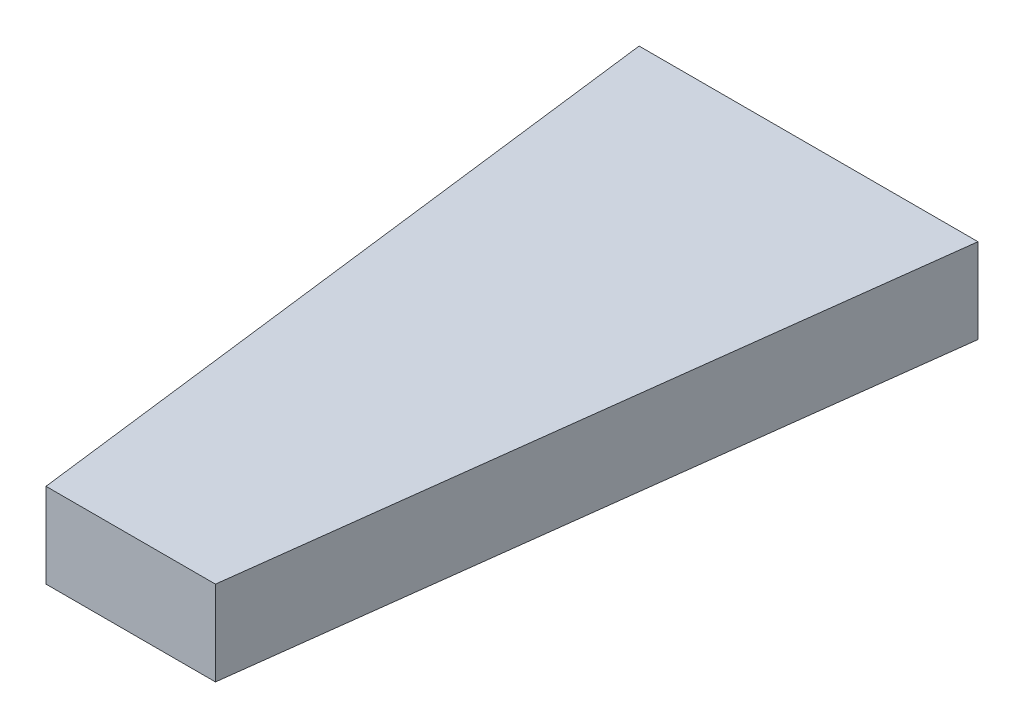
ISO-10303-21;
HEADER;
FILE_DESCRIPTION(('STEP AP214'),'2;1');
FILE_NAME('part.step','',(''),(''),'','','');
FILE_SCHEMA(('AUTOMOTIVE_DESIGN { 1 0 10303 214 1 1 1 1 }'));
ENDSEC;
DATA;
#1=APPLICATION_CONTEXT('core data for automotive mechanical design processes');
#2=APPLICATION_PROTOCOL_DEFINITION('international standard','automotive_design',2000,#1);
#3=PRODUCT_CONTEXT('',#1,'mechanical');
#4=PRODUCT('Part','Part','',(#3));
#5=PRODUCT_RELATED_PRODUCT_CATEGORY('part','',(#4));
#6=PRODUCT_DEFINITION_FORMATION('','',#4);
#7=PRODUCT_DEFINITION_CONTEXT('part definition',#1,'design');
#8=PRODUCT_DEFINITION('design','',#6,#7);
#9=PRODUCT_DEFINITION_SHAPE('','',#8);
#10=(LENGTH_UNIT() NAMED_UNIT(*) SI_UNIT(.MILLI.,.METRE.));
#11=(NAMED_UNIT(*) PLANE_ANGLE_UNIT() SI_UNIT($,.RADIAN.));
#12=(NAMED_UNIT(*) SI_UNIT($,.STERADIAN.) SOLID_ANGLE_UNIT());
#13=UNCERTAINTY_MEASURE_WITH_UNIT(LENGTH_MEASURE(1.E-05),#10,'distance_accuracy_value','');
#14=(GEOMETRIC_REPRESENTATION_CONTEXT(3) GLOBAL_UNCERTAINTY_ASSIGNED_CONTEXT((#13)) GLOBAL_UNIT_ASSIGNED_CONTEXT((#10,
#11,#12)) REPRESENTATION_CONTEXT('',''));
#15=CARTESIAN_POINT('',(0.,0.,0.));
#16=DIRECTION('',(0.,0.,1.));
#17=DIRECTION('',(1.,0.,0.));
#18=AXIS2_PLACEMENT_3D('',#15,#16,#17);
#19=CARTESIAN_POINT('',(-12.7,12.7,101.6));
#20=DIRECTION('',(0.992277876713668,0.,-0.124034734589209));
#21=DIRECTION('',(-0.124034734589209,0.,-0.992277876713668));
#22=AXIS2_PLACEMENT_3D('',#19,#20,#21);
#23=PLANE('',#22);
#24=DIRECTION('',(0.124034734589209,0.,0.992277876713668));
#25=VECTOR('',#24,1.);
#26=CARTESIAN_POINT('',(-12.7,0.,101.6));
#27=LINE('',#26,#25);
#28=CARTESIAN_POINT('',(-25.4,0.,0.));
#29=VERTEX_POINT('',#28);
#30=CARTESIAN_POINT('',(-12.7,0.,101.6));
#31=VERTEX_POINT('',#30);
#32=EDGE_CURVE('E96',#29,#31,#27,.T.);
#33=ORIENTED_EDGE('',*,*,#32,.T.);
#34=DIRECTION('',(0.,-1.,0.));
#35=VECTOR('',#34,1.);
#36=CARTESIAN_POINT('',(-12.7,12.7,101.6));
#37=LINE('',#36,#35);
#38=CARTESIAN_POINT('',(-12.7,12.7,101.6));
#39=VERTEX_POINT('',#38);
#40=EDGE_CURVE('E11',#39,#31,#37,.T.);
#41=ORIENTED_EDGE('',*,*,#40,.F.);
#42=DIRECTION('',(0.124034734589209,0.,0.992277876713668));
#43=VECTOR('',#42,1.);
#44=CARTESIAN_POINT('',(-12.7,12.7,101.6));
#45=LINE('',#44,#43);
#46=CARTESIAN_POINT('',(-25.4,12.7,0.));
#47=VERTEX_POINT('',#46);
#48=EDGE_CURVE('E84',#47,#39,#45,.T.);
#49=ORIENTED_EDGE('',*,*,#48,.F.);
#50=DIRECTION('',(0.,-1.,0.));
#51=VECTOR('',#50,1.);
#52=CARTESIAN_POINT('',(-25.4,12.7,0.));
#53=LINE('',#52,#51);
#54=EDGE_CURVE('E92',#47,#29,#53,.T.);
#55=ORIENTED_EDGE('',*,*,#54,.T.);
#56=EDGE_LOOP('',(#33,#41,#49,#55));
#57=FACE_BOUND('',#56,.T.);
#58=ADVANCED_FACE('F33',(#57),#23,.F.);
#59=CARTESIAN_POINT('',(12.7,12.7,101.6));
#60=DIRECTION('',(0.,0.,-1.));
#61=DIRECTION('',(-1.,0.,0.));
#62=AXIS2_PLACEMENT_3D('',#59,#60,#61);
#63=PLANE('',#62);
#64=DIRECTION('',(1.,0.,0.));
#65=VECTOR('',#64,1.);
#66=CARTESIAN_POINT('',(12.7,0.,101.6));
#67=LINE('',#66,#65);
#68=CARTESIAN_POINT('',(12.7,0.,101.6));
#69=VERTEX_POINT('',#68);
#70=EDGE_CURVE('E88',#31,#69,#67,.T.);
#71=ORIENTED_EDGE('',*,*,#70,.T.);
#72=DIRECTION('',(0.,-1.,0.));
#73=VECTOR('',#72,1.);
#74=CARTESIAN_POINT('',(12.7,12.7,101.6));
#75=LINE('',#74,#73);
#76=CARTESIAN_POINT('',(12.7,12.7,101.6));
#77=VERTEX_POINT('',#76);
#78=EDGE_CURVE('E41',#77,#69,#75,.T.);
#79=ORIENTED_EDGE('',*,*,#78,.F.);
#80=DIRECTION('',(1.,0.,0.));
#81=VECTOR('',#80,1.);
#82=CARTESIAN_POINT('',(12.7,12.7,101.6));
#83=LINE('',#82,#81);
#84=EDGE_CURVE('E79',#39,#77,#83,.T.);
#85=ORIENTED_EDGE('',*,*,#84,.F.);
#86=ORIENTED_EDGE('',*,*,#40,.T.);
#87=EDGE_LOOP('',(#71,#79,#85,#86));
#88=FACE_BOUND('',#87,.T.);
#89=ADVANCED_FACE('F87',(#88),#63,.F.);
#90=CARTESIAN_POINT('',(25.4,12.7,0.));
#91=DIRECTION('',(-0.992277876713668,0.,-0.124034734589208));
#92=DIRECTION('',(-0.124034734589208,0.,0.992277876713668));
#93=AXIS2_PLACEMENT_3D('',#90,#91,#92);
#94=PLANE('',#93);
#95=DIRECTION('',(0.124034734589208,0.,-0.992277876713668));
#96=VECTOR('',#95,1.);
#97=CARTESIAN_POINT('',(25.4,0.,0.));
#98=LINE('',#97,#96);
#99=CARTESIAN_POINT('',(25.4,0.,0.));
#100=VERTEX_POINT('',#99);
#101=EDGE_CURVE('E66',#69,#100,#98,.T.);
#102=ORIENTED_EDGE('',*,*,#101,.T.);
#103=DIRECTION('',(0.,-1.,0.));
#104=VECTOR('',#103,1.);
#105=CARTESIAN_POINT('',(25.4,12.7,0.));
#106=LINE('',#105,#104);
#107=CARTESIAN_POINT('',(25.4,12.7,0.));
#108=VERTEX_POINT('',#107);
#109=EDGE_CURVE('E89',#108,#100,#106,.T.);
#110=ORIENTED_EDGE('',*,*,#109,.F.);
#111=DIRECTION('',(0.124034734589208,0.,-0.992277876713668));
#112=VECTOR('',#111,1.);
#113=CARTESIAN_POINT('',(25.4,12.7,0.));
#114=LINE('',#113,#112);
#115=EDGE_CURVE('E82',#77,#108,#114,.T.);
#116=ORIENTED_EDGE('',*,*,#115,.F.);
#117=ORIENTED_EDGE('',*,*,#78,.T.);
#118=EDGE_LOOP('',(#102,#110,#116,#117));
#119=FACE_BOUND('',#118,.T.);
#120=ADVANCED_FACE('F90',(#119),#94,.F.);
#121=CARTESIAN_POINT('',(-25.4,12.7,0.));
#122=DIRECTION('',(0.,0.,1.));
#123=DIRECTION('',(1.,0.,0.));
#124=AXIS2_PLACEMENT_3D('',#121,#122,#123);
#125=PLANE('',#124);
#126=DIRECTION('',(-1.,0.,0.));
#127=VECTOR('',#126,1.);
#128=CARTESIAN_POINT('',(-25.4,0.,0.));
#129=LINE('',#128,#127);
#130=EDGE_CURVE('E72',#100,#29,#129,.T.);
#131=ORIENTED_EDGE('',*,*,#130,.T.);
#132=ORIENTED_EDGE('',*,*,#54,.F.);
#133=DIRECTION('',(-1.,0.,0.));
#134=VECTOR('',#133,1.);
#135=CARTESIAN_POINT('',(-25.4,12.7,0.));
#136=LINE('',#135,#134);
#137=EDGE_CURVE('E49',#108,#47,#136,.T.);
#138=ORIENTED_EDGE('',*,*,#137,.F.);
#139=ORIENTED_EDGE('',*,*,#109,.T.);
#140=EDGE_LOOP('',(#131,#132,#138,#139));
#141=FACE_BOUND('',#140,.T.);
#142=ADVANCED_FACE('F103',(#141),#125,.F.);
#143=CARTESIAN_POINT('',(0.,12.7,0.));
#144=DIRECTION('',(0.,-1.,0.));
#145=DIRECTION('',(0.,0.,-1.));
#146=AXIS2_PLACEMENT_3D('',#143,#144,#145);
#147=PLANE('',#146);
#148=ORIENTED_EDGE('',*,*,#48,.T.);
#149=ORIENTED_EDGE('',*,*,#84,.T.);
#150=ORIENTED_EDGE('',*,*,#115,.T.);
#151=ORIENTED_EDGE('',*,*,#137,.T.);
#152=EDGE_LOOP('',(#148,#149,#150,#151));
#153=FACE_BOUND('',#152,.T.);
#154=ADVANCED_FACE('F80',(#153),#147,.F.);
#155=CARTESIAN_POINT('',(0.,0.,0.));
#156=DIRECTION('',(0.,-1.,0.));
#157=DIRECTION('',(0.,0.,-1.));
#158=AXIS2_PLACEMENT_3D('',#155,#156,#157);
#159=PLANE('',#158);
#160=ORIENTED_EDGE('',*,*,#32,.F.);
#161=ORIENTED_EDGE('',*,*,#130,.F.);
#162=ORIENTED_EDGE('',*,*,#101,.F.);
#163=ORIENTED_EDGE('',*,*,#70,.F.);
#164=EDGE_LOOP('',(#160,#161,#162,#163));
#165=FACE_BOUND('',#164,.T.);
#166=ADVANCED_FACE('F106',(#165),#159,.T.);
#167=CLOSED_SHELL('',(#58,#89,#120,#142,#154,#166));
#168=MANIFOLD_SOLID_BREP('B2',#167);
#169=ADVANCED_BREP_SHAPE_REPRESENTATION('',(#18,#168),#14);
#170=SHAPE_DEFINITION_REPRESENTATION(#9,#169);
ENDSEC;
END-ISO-10303-21;
